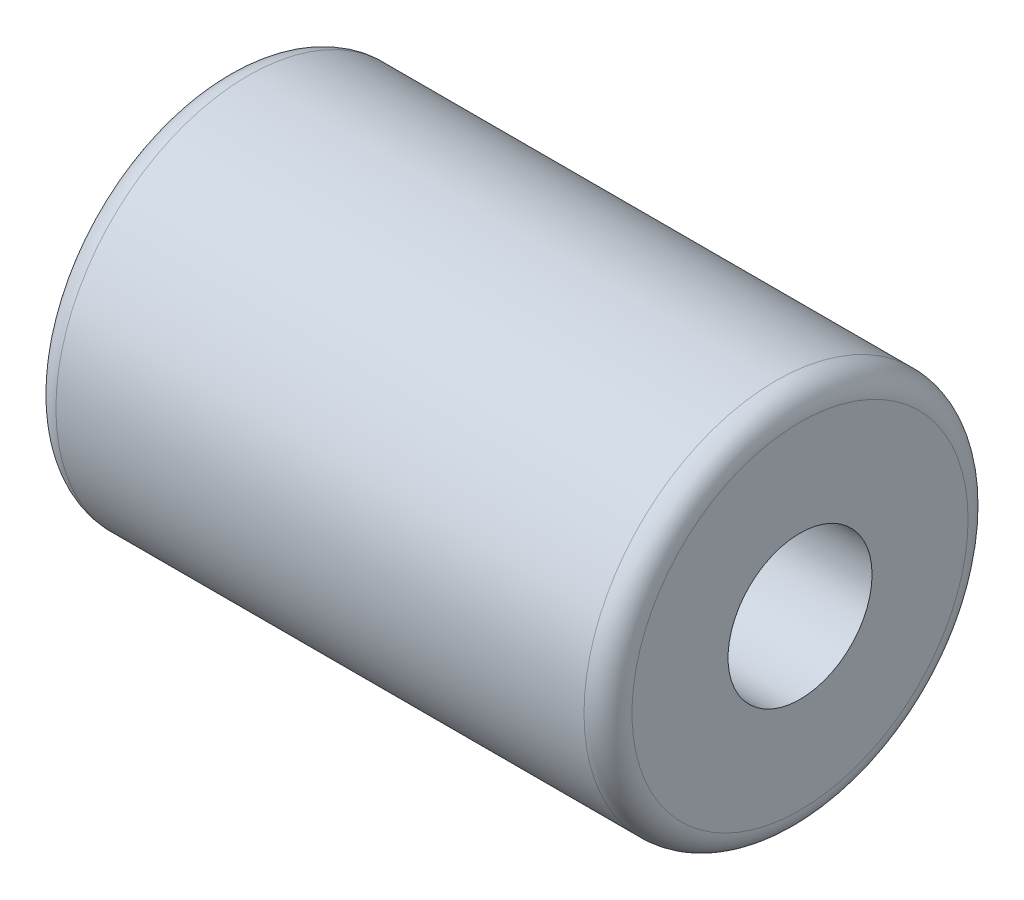
ISO-10303-21;
HEADER;
FILE_DESCRIPTION(('STEP AP214'),'2;1');
FILE_NAME('part.step','',(''),(''),'','','');
FILE_SCHEMA(('AUTOMOTIVE_DESIGN { 1 0 10303 214 1 1 1 1 }'));
ENDSEC;
DATA;
#1=APPLICATION_CONTEXT('core data for automotive mechanical design processes');
#2=APPLICATION_PROTOCOL_DEFINITION('international standard','automotive_design',2000,#1);
#3=PRODUCT_CONTEXT('',#1,'mechanical');
#4=PRODUCT('Part','Part','',(#3));
#5=PRODUCT_RELATED_PRODUCT_CATEGORY('part','',(#4));
#6=PRODUCT_DEFINITION_FORMATION('','',#4);
#7=PRODUCT_DEFINITION_CONTEXT('part definition',#1,'design');
#8=PRODUCT_DEFINITION('design','',#6,#7);
#9=PRODUCT_DEFINITION_SHAPE('','',#8);
#10=(LENGTH_UNIT() NAMED_UNIT(*) SI_UNIT(.MILLI.,.METRE.));
#11=(NAMED_UNIT(*) PLANE_ANGLE_UNIT() SI_UNIT($,.RADIAN.));
#12=(NAMED_UNIT(*) SI_UNIT($,.STERADIAN.) SOLID_ANGLE_UNIT());
#13=UNCERTAINTY_MEASURE_WITH_UNIT(LENGTH_MEASURE(1.E-05),#10,'distance_accuracy_value','');
#14=(GEOMETRIC_REPRESENTATION_CONTEXT(3) GLOBAL_UNCERTAINTY_ASSIGNED_CONTEXT((#13)) GLOBAL_UNIT_ASSIGNED_CONTEXT((#10,
#11,#12)) REPRESENTATION_CONTEXT('',''));
#15=CARTESIAN_POINT('',(0.,0.,0.));
#16=DIRECTION('',(0.,0.,1.));
#17=DIRECTION('',(1.,0.,0.));
#18=AXIS2_PLACEMENT_3D('',#15,#16,#17);
#19=CARTESIAN_POINT('',(12.,0.,0.));
#20=DIRECTION('',(1.,0.,0.));
#21=DIRECTION('',(0.,0.,-1.));
#22=AXIS2_PLACEMENT_3D('',#19,#20,#21);
#23=PLANE('',#22);
#24=CARTESIAN_POINT('',(12.,0.,0.));
#25=DIRECTION('',(1.,0.,0.));
#26=DIRECTION('',(0.,0.,-1.));
#27=AXIS2_PLACEMENT_3D('',#24,#25,#26);
#28=CIRCLE('',#27,3.5);
#29=CARTESIAN_POINT('',(12.,0.,-3.5));
#30=VERTEX_POINT('',#29);
#31=EDGE_CURVE('E10',#30,#30,#28,.T.);
#32=ORIENTED_EDGE('',*,*,#31,.T.);
#33=EDGE_LOOP('',(#32));
#34=FACE_BOUND('',#33,.T.);
#35=CARTESIAN_POINT('',(12.,0.,0.));
#36=DIRECTION('',(1.,0.,0.));
#37=DIRECTION('',(0.,0.,-1.));
#38=AXIS2_PLACEMENT_3D('',#35,#36,#37);
#39=CIRCLE('',#38,1.5);
#40=CARTESIAN_POINT('',(12.,0.,-1.5));
#41=VERTEX_POINT('',#40);
#42=EDGE_CURVE('E50',#41,#41,#39,.T.);
#43=ORIENTED_EDGE('',*,*,#42,.F.);
#44=EDGE_LOOP('',(#43));
#45=FACE_BOUND('',#44,.T.);
#46=ADVANCED_FACE('F30',(#34,#45),#23,.T.);
#47=CARTESIAN_POINT('',(0.,0.,0.));
#48=DIRECTION('',(1.,0.,0.));
#49=DIRECTION('',(0.,0.,-1.));
#50=AXIS2_PLACEMENT_3D('',#47,#48,#49);
#51=PLANE('',#50);
#52=CARTESIAN_POINT('',(0.,0.,0.));
#53=DIRECTION('',(1.,0.,0.));
#54=DIRECTION('',(0.,0.,-1.));
#55=AXIS2_PLACEMENT_3D('',#52,#53,#54);
#56=CIRCLE('',#55,3.5);
#57=CARTESIAN_POINT('',(0.,0.,-3.5));
#58=VERTEX_POINT('',#57);
#59=EDGE_CURVE('E37',#58,#58,#56,.F.);
#60=ORIENTED_EDGE('',*,*,#59,.T.);
#61=EDGE_LOOP('',(#60));
#62=FACE_BOUND('',#61,.T.);
#63=CARTESIAN_POINT('',(0.,0.,0.));
#64=DIRECTION('',(1.,0.,0.));
#65=DIRECTION('',(0.,0.,-1.));
#66=AXIS2_PLACEMENT_3D('',#63,#64,#65);
#67=CIRCLE('',#66,1.5);
#68=CARTESIAN_POINT('',(0.,0.,-1.5));
#69=VERTEX_POINT('',#68);
#70=EDGE_CURVE('E51',#69,#69,#67,.T.);
#71=ORIENTED_EDGE('',*,*,#70,.T.);
#72=EDGE_LOOP('',(#71));
#73=FACE_BOUND('',#72,.T.);
#74=ADVANCED_FACE('F61',(#62,#73),#51,.F.);
#75=CARTESIAN_POINT('',(12.,0.,0.));
#76=DIRECTION('',(-1.,0.,0.));
#77=DIRECTION('',(0.,0.,1.));
#78=AXIS2_PLACEMENT_3D('',#75,#76,#77);
#79=CYLINDRICAL_SURFACE('',#78,4.);
#80=CARTESIAN_POINT('',(0.5,0.,0.));
#81=DIRECTION('',(1.,0.,0.));
#82=DIRECTION('',(0.,0.,-1.));
#83=AXIS2_PLACEMENT_3D('',#80,#81,#82);
#84=CIRCLE('',#83,4.);
#85=CARTESIAN_POINT('',(0.5,0.,-4.));
#86=VERTEX_POINT('',#85);
#87=EDGE_CURVE('E41',#86,#86,#84,.T.);
#88=ORIENTED_EDGE('',*,*,#87,.T.);
#89=EDGE_LOOP('',(#88));
#90=FACE_BOUND('',#89,.T.);
#91=CARTESIAN_POINT('',(11.5,0.,0.));
#92=DIRECTION('',(1.,0.,0.));
#93=DIRECTION('',(0.,0.,-1.));
#94=AXIS2_PLACEMENT_3D('',#91,#92,#93);
#95=CIRCLE('',#94,4.);
#96=CARTESIAN_POINT('',(11.5,0.,-4.));
#97=VERTEX_POINT('',#96);
#98=EDGE_CURVE('E45',#97,#97,#95,.F.);
#99=ORIENTED_EDGE('',*,*,#98,.T.);
#100=EDGE_LOOP('',(#99));
#101=FACE_BOUND('',#100,.T.);
#102=ADVANCED_FACE('F66',(#90,#101),#79,.T.);
#103=CARTESIAN_POINT('',(12.,0.,0.));
#104=DIRECTION('',(-1.,0.,0.));
#105=DIRECTION('',(0.,0.,1.));
#106=AXIS2_PLACEMENT_3D('',#103,#104,#105);
#107=CYLINDRICAL_SURFACE('',#106,1.5);
#108=ORIENTED_EDGE('',*,*,#42,.T.);
#109=EDGE_LOOP('',(#108));
#110=FACE_BOUND('',#109,.T.);
#111=ORIENTED_EDGE('',*,*,#70,.F.);
#112=EDGE_LOOP('',(#111));
#113=FACE_BOUND('',#112,.T.);
#114=ADVANCED_FACE('F57',(#110,#113),#107,.F.);
#115=CARTESIAN_POINT('',(0.5,0.,0.));
#116=DIRECTION('',(1.,0.,0.));
#117=DIRECTION('',(0.,0.,-1.));
#118=AXIS2_PLACEMENT_3D('',#115,#116,#117);
#119=TOROIDAL_SURFACE('',#118,3.5,0.5);
#120=ORIENTED_EDGE('',*,*,#59,.F.);
#121=EDGE_LOOP('',(#120));
#122=FACE_BOUND('',#121,.T.);
#123=ORIENTED_EDGE('',*,*,#87,.F.);
#124=EDGE_LOOP('',(#123));
#125=FACE_BOUND('',#124,.T.);
#126=ADVANCED_FACE('F72',(#122,#125),#119,.T.);
#127=CARTESIAN_POINT('',(11.5,0.,0.));
#128=DIRECTION('',(1.,0.,0.));
#129=DIRECTION('',(0.,0.,-1.));
#130=AXIS2_PLACEMENT_3D('',#127,#128,#129);
#131=TOROIDAL_SURFACE('',#130,3.5,0.5);
#132=ORIENTED_EDGE('',*,*,#98,.F.);
#133=EDGE_LOOP('',(#132));
#134=FACE_BOUND('',#133,.T.);
#135=ORIENTED_EDGE('',*,*,#31,.F.);
#136=EDGE_LOOP('',(#135));
#137=FACE_BOUND('',#136,.T.);
#138=ADVANCED_FACE('F32',(#134,#137),#131,.T.);
#139=CLOSED_SHELL('',(#46,#74,#102,#114,#126,#138));
#140=MANIFOLD_SOLID_BREP('B2',#139);
#141=ADVANCED_BREP_SHAPE_REPRESENTATION('',(#18,#140),#14);
#142=SHAPE_DEFINITION_REPRESENTATION(#9,#141);
ENDSEC;
END-ISO-10303-21;
